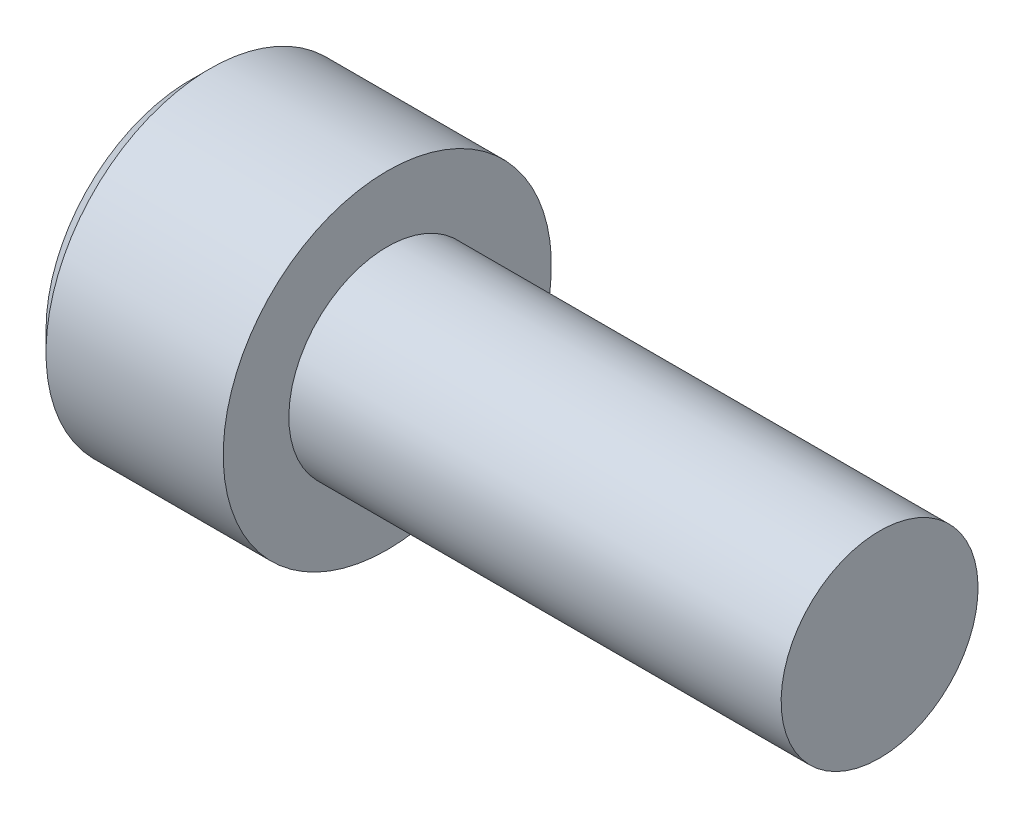
ISO-10303-21;
HEADER;
FILE_DESCRIPTION(('STEP AP214'),'2;1');
FILE_NAME('part.step','',(''),(''),'','','');
FILE_SCHEMA(('AUTOMOTIVE_DESIGN { 1 0 10303 214 1 1 1 1 }'));
ENDSEC;
DATA;
#1=APPLICATION_CONTEXT('core data for automotive mechanical design processes');
#2=APPLICATION_PROTOCOL_DEFINITION('international standard','automotive_design',2000,#1);
#3=PRODUCT_CONTEXT('',#1,'mechanical');
#4=PRODUCT('Part','Part','',(#3));
#5=PRODUCT_RELATED_PRODUCT_CATEGORY('part','',(#4));
#6=PRODUCT_DEFINITION_FORMATION('','',#4);
#7=PRODUCT_DEFINITION_CONTEXT('part definition',#1,'design');
#8=PRODUCT_DEFINITION('design','',#6,#7);
#9=PRODUCT_DEFINITION_SHAPE('','',#8);
#10=(LENGTH_UNIT() NAMED_UNIT(*) SI_UNIT(.MILLI.,.METRE.));
#11=(NAMED_UNIT(*) PLANE_ANGLE_UNIT() SI_UNIT($,.RADIAN.));
#12=(NAMED_UNIT(*) SI_UNIT($,.STERADIAN.) SOLID_ANGLE_UNIT());
#13=UNCERTAINTY_MEASURE_WITH_UNIT(LENGTH_MEASURE(1.E-05),#10,'distance_accuracy_value','');
#14=(GEOMETRIC_REPRESENTATION_CONTEXT(3) GLOBAL_UNCERTAINTY_ASSIGNED_CONTEXT((#13)) GLOBAL_UNIT_ASSIGNED_CONTEXT((#10,
#11,#12)) REPRESENTATION_CONTEXT('',''));
#15=CARTESIAN_POINT('',(0.,0.,0.));
#16=DIRECTION('',(0.,0.,1.));
#17=DIRECTION('',(1.,0.,0.));
#18=AXIS2_PLACEMENT_3D('',#15,#16,#17);
#19=CARTESIAN_POINT('',(-3.,0.,0.));
#20=DIRECTION('',(-1.,0.,0.));
#21=DIRECTION('',(0.,0.,1.));
#22=AXIS2_PLACEMENT_3D('',#19,#20,#21);
#23=PLANE('',#22);
#24=CARTESIAN_POINT('',(-2.9999999999998,0.,0.));
#25=DIRECTION('',(-1.,0.,0.));
#26=DIRECTION('',(0.,0.,1.));
#27=AXIS2_PLACEMENT_3D('',#24,#25,#26);
#28=CIRCLE('',#27,2.49999999999995);
#29=CARTESIAN_POINT('',(-2.9999999999999,2.16506350946107,1.24999999999999));
#30=VERTEX_POINT('',#29);
#31=CARTESIAN_POINT('',(-2.9999999999999,0.,2.49999999999997));
#32=VERTEX_POINT('',#31);
#33=EDGE_CURVE('E20',#30,#32,#28,.F.);
#34=ORIENTED_EDGE('',*,*,#33,.T.);
#35=DIRECTION('',(0.,1.,0.));
#36=VECTOR('',#35,1.);
#37=CARTESIAN_POINT('',(-3.,0.,2.5));
#38=LINE('',#37,#36);
#39=CARTESIAN_POINT('',(-3.,1.44337567297406,2.5));
#40=VERTEX_POINT('',#39);
#41=EDGE_CURVE('E85',#32,#40,#38,.T.);
#42=ORIENTED_EDGE('',*,*,#41,.T.);
#43=DIRECTION('',(0.,0.5,-0.866025403784439));
#44=VECTOR('',#43,1.);
#45=CARTESIAN_POINT('',(-3.,1.44337567297406,2.5));
#46=LINE('',#45,#44);
#47=EDGE_CURVE('E105',#40,#30,#46,.T.);
#48=ORIENTED_EDGE('',*,*,#47,.T.);
#49=EDGE_LOOP('',(#34,#42,#48));
#50=FACE_BOUND('',#49,.T.);
#51=ADVANCED_FACE('F17',(#50),#23,.T.);
#52=CARTESIAN_POINT('',(-3.,0.,0.));
#53=DIRECTION('',(-1.,0.,0.));
#54=DIRECTION('',(0.,0.,1.));
#55=AXIS2_PLACEMENT_3D('',#52,#53,#54);
#56=PLANE('',#55);
#57=CARTESIAN_POINT('',(-2.9999999999998,0.,0.));
#58=DIRECTION('',(-1.,0.,0.));
#59=DIRECTION('',(0.,0.,1.));
#60=AXIS2_PLACEMENT_3D('',#57,#58,#59);
#61=CIRCLE('',#60,2.49999999999995);
#62=CARTESIAN_POINT('',(-2.9999999999999,-2.16506350946107,1.24999999999999));
#63=VERTEX_POINT('',#62);
#64=EDGE_CURVE('E115',#32,#63,#61,.F.);
#65=ORIENTED_EDGE('',*,*,#64,.T.);
#66=DIRECTION('',(0.,0.5,0.866025403784439));
#67=VECTOR('',#66,1.);
#68=CARTESIAN_POINT('',(-3.,-2.1650635094611,1.25));
#69=LINE('',#68,#67);
#70=CARTESIAN_POINT('',(-3.,-1.44337567297406,2.5));
#71=VERTEX_POINT('',#70);
#72=EDGE_CURVE('E123',#63,#71,#69,.T.);
#73=ORIENTED_EDGE('',*,*,#72,.T.);
#74=DIRECTION('',(0.,1.,0.));
#75=VECTOR('',#74,1.);
#76=CARTESIAN_POINT('',(-3.,0.,2.5));
#77=LINE('',#76,#75);
#78=EDGE_CURVE('E131',#71,#32,#77,.T.);
#79=ORIENTED_EDGE('',*,*,#78,.T.);
#80=EDGE_LOOP('',(#65,#73,#79));
#81=FACE_BOUND('',#80,.T.);
#82=ADVANCED_FACE('F367',(#81),#56,.T.);
#83=CARTESIAN_POINT('',(-3.,0.,0.));
#84=DIRECTION('',(-1.,0.,0.));
#85=DIRECTION('',(0.,0.,1.));
#86=AXIS2_PLACEMENT_3D('',#83,#84,#85);
#87=PLANE('',#86);
#88=CARTESIAN_POINT('',(-2.9999999999998,0.,0.));
#89=DIRECTION('',(-1.,0.,0.));
#90=DIRECTION('',(0.,0.,1.));
#91=AXIS2_PLACEMENT_3D('',#88,#89,#90);
#92=CIRCLE('',#91,2.49999999999995);
#93=CARTESIAN_POINT('',(-2.9999999999999,0.,-2.49999999999997));
#94=VERTEX_POINT('',#93);
#95=CARTESIAN_POINT('',(-2.9999999999999,2.16506350946107,-1.24999999999999));
#96=VERTEX_POINT('',#95);
#97=EDGE_CURVE('E101',#94,#96,#92,.F.);
#98=ORIENTED_EDGE('',*,*,#97,.T.);
#99=DIRECTION('',(0.,-0.5,-0.866025403784439));
#100=VECTOR('',#99,1.);
#101=CARTESIAN_POINT('',(-3.,2.1650635094611,-1.25));
#102=LINE('',#101,#100);
#103=CARTESIAN_POINT('',(-3.,1.44337567297406,-2.5));
#104=VERTEX_POINT('',#103);
#105=EDGE_CURVE('E116',#96,#104,#102,.T.);
#106=ORIENTED_EDGE('',*,*,#105,.T.);
#107=DIRECTION('',(0.,1.,0.));
#108=VECTOR('',#107,1.);
#109=CARTESIAN_POINT('',(-3.,0.,-2.5));
#110=LINE('',#109,#108);
#111=EDGE_CURVE('E119',#104,#94,#110,.F.);
#112=ORIENTED_EDGE('',*,*,#111,.T.);
#113=EDGE_LOOP('',(#98,#106,#112));
#114=FACE_BOUND('',#113,.T.);
#115=ADVANCED_FACE('F358',(#114),#87,.T.);
#116=CARTESIAN_POINT('',(-2.99999999999967,0.,0.));
#117=DIRECTION('',(-1.,0.,0.));
#118=DIRECTION('',(0.,0.,1.));
#119=AXIS2_PLACEMENT_3D('',#116,#117,#118);
#120=CONICAL_SURFACE('',#119,2.49999999999972,1.04719755119659);
#121=CARTESIAN_POINT('',(-1.5566243270258,0.,0.));
#122=VERTEX_POINT('',#121);
#123=VERTEX_LOOP('',#122);
#124=FACE_BOUND('',#123,.T.);
#125=ORIENTED_EDGE('',*,*,#33,.F.);
#126=CARTESIAN_POINT('',(-2.9999999999998,0.,0.));
#127=DIRECTION('',(-1.,0.,0.));
#128=DIRECTION('',(0.,0.,1.));
#129=AXIS2_PLACEMENT_3D('',#126,#127,#128);
#130=CIRCLE('',#129,2.49999999999995);
#131=EDGE_CURVE('E91',#96,#30,#130,.F.);
#132=ORIENTED_EDGE('',*,*,#131,.F.);
#133=ORIENTED_EDGE('',*,*,#97,.F.);
#134=CARTESIAN_POINT('',(-2.9999999999998,0.,0.));
#135=DIRECTION('',(-1.,0.,0.));
#136=DIRECTION('',(0.,0.,1.));
#137=AXIS2_PLACEMENT_3D('',#134,#135,#136);
#138=CIRCLE('',#137,2.49999999999995);
#139=CARTESIAN_POINT('',(-2.9999999999999,-2.16506350946107,-1.24999999999999));
#140=VERTEX_POINT('',#139);
#141=EDGE_CURVE('E153',#140,#94,#138,.F.);
#142=ORIENTED_EDGE('',*,*,#141,.F.);
#143=CARTESIAN_POINT('',(-2.9999999999998,0.,0.));
#144=DIRECTION('',(-1.,0.,0.));
#145=DIRECTION('',(0.,0.,1.));
#146=AXIS2_PLACEMENT_3D('',#143,#144,#145);
#147=CIRCLE('',#146,2.49999999999995);
#148=EDGE_CURVE('E117',#63,#140,#147,.F.);
#149=ORIENTED_EDGE('',*,*,#148,.F.);
#150=ORIENTED_EDGE('',*,*,#64,.F.);
#151=EDGE_LOOP('',(#125,#132,#133,#142,#149,#150));
#152=FACE_BOUND('',#151,.T.);
#153=ADVANCED_FACE('F113',(#124,#152),#120,.F.);
#154=CARTESIAN_POINT('',(-3.,0.,0.));
#155=DIRECTION('',(-1.,0.,0.));
#156=DIRECTION('',(0.,0.,1.));
#157=AXIS2_PLACEMENT_3D('',#154,#155,#156);
#158=PLANE('',#157);
#159=ORIENTED_EDGE('',*,*,#141,.T.);
#160=DIRECTION('',(0.,1.,0.));
#161=VECTOR('',#160,1.);
#162=CARTESIAN_POINT('',(-3.,1.44337567297407,-2.5));
#163=LINE('',#162,#161);
#164=CARTESIAN_POINT('',(-3.,-1.44337567297406,-2.5));
#165=VERTEX_POINT('',#164);
#166=EDGE_CURVE('E155',#94,#165,#163,.F.);
#167=ORIENTED_EDGE('',*,*,#166,.T.);
#168=DIRECTION('',(0.,-0.5,0.866025403784438));
#169=VECTOR('',#168,1.);
#170=CARTESIAN_POINT('',(-3.,-1.44337567297406,-2.5));
#171=LINE('',#170,#169);
#172=EDGE_CURVE('E100',#165,#140,#171,.T.);
#173=ORIENTED_EDGE('',*,*,#172,.T.);
#174=EDGE_LOOP('',(#159,#167,#173));
#175=FACE_BOUND('',#174,.T.);
#176=ADVANCED_FACE('F177',(#175),#158,.T.);
#177=CARTESIAN_POINT('',(-3.,0.,0.));
#178=DIRECTION('',(-1.,0.,0.));
#179=DIRECTION('',(0.,0.,1.));
#180=AXIS2_PLACEMENT_3D('',#177,#178,#179);
#181=PLANE('',#180);
#182=ORIENTED_EDGE('',*,*,#148,.T.);
#183=DIRECTION('',(0.,0.5,-0.866025403784439));
#184=VECTOR('',#183,1.);
#185=CARTESIAN_POINT('',(-3.,-1.44337567297406,-2.5));
#186=LINE('',#185,#184);
#187=CARTESIAN_POINT('',(-3.,-2.88675134594813,0.));
#188=VERTEX_POINT('',#187);
#189=EDGE_CURVE('E162',#140,#188,#186,.F.);
#190=ORIENTED_EDGE('',*,*,#189,.T.);
#191=DIRECTION('',(0.,-0.5,-0.866025403784439));
#192=VECTOR('',#191,1.);
#193=CARTESIAN_POINT('',(-3.,-2.88675134594813,0.));
#194=LINE('',#193,#192);
#195=EDGE_CURVE('E141',#188,#63,#194,.F.);
#196=ORIENTED_EDGE('',*,*,#195,.T.);
#197=EDGE_LOOP('',(#182,#190,#196));
#198=FACE_BOUND('',#197,.T.);
#199=ADVANCED_FACE('F161',(#198),#181,.T.);
#200=CARTESIAN_POINT('',(-3.,0.,0.));
#201=DIRECTION('',(-1.,0.,0.));
#202=DIRECTION('',(0.,0.,1.));
#203=AXIS2_PLACEMENT_3D('',#200,#201,#202);
#204=PLANE('',#203);
#205=ORIENTED_EDGE('',*,*,#131,.T.);
#206=DIRECTION('',(0.,-0.5,0.866025403784439));
#207=VECTOR('',#206,1.);
#208=CARTESIAN_POINT('',(-3.,1.44337567297406,2.5));
#209=LINE('',#208,#207);
#210=CARTESIAN_POINT('',(-3.,2.88675134594813,0.));
#211=VERTEX_POINT('',#210);
#212=EDGE_CURVE('E94',#30,#211,#209,.F.);
#213=ORIENTED_EDGE('',*,*,#212,.T.);
#214=DIRECTION('',(0.,0.5,0.866025403784439));
#215=VECTOR('',#214,1.);
#216=CARTESIAN_POINT('',(-3.,2.88675134594813,0.));
#217=LINE('',#216,#215);
#218=EDGE_CURVE('E96',#211,#96,#217,.F.);
#219=ORIENTED_EDGE('',*,*,#218,.T.);
#220=EDGE_LOOP('',(#205,#213,#219));
#221=FACE_BOUND('',#220,.T.);
#222=ADVANCED_FACE('F93',(#221),#204,.T.);
#223=CARTESIAN_POINT('',(-3.,1.44337567297407,-2.5));
#224=DIRECTION('',(0.,0.,-1.));
#225=DIRECTION('',(-1.,0.,0.));
#226=AXIS2_PLACEMENT_3D('',#223,#224,#225);
#227=PLANE('',#226);
#228=DIRECTION('',(1.,0.,0.));
#229=VECTOR('',#228,1.);
#230=CARTESIAN_POINT('',(-3.,-1.44337567297406,-2.5));
#231=LINE('',#230,#229);
#232=CARTESIAN_POINT('',(-6.,-1.44337567297406,-2.5));
#233=VERTEX_POINT('',#232);
#234=EDGE_CURVE('E126',#233,#165,#231,.T.);
#235=ORIENTED_EDGE('',*,*,#234,.T.);
#236=ORIENTED_EDGE('',*,*,#166,.F.);
#237=ORIENTED_EDGE('',*,*,#111,.F.);
#238=DIRECTION('',(1.,0.,0.));
#239=VECTOR('',#238,1.);
#240=CARTESIAN_POINT('',(-3.,1.44337567297407,-2.5));
#241=LINE('',#240,#239);
#242=CARTESIAN_POINT('',(-6.,1.44337567297407,-2.5));
#243=VERTEX_POINT('',#242);
#244=EDGE_CURVE('E134',#104,#243,#241,.F.);
#245=ORIENTED_EDGE('',*,*,#244,.T.);
#246=DIRECTION('',(0.,1.,0.));
#247=VECTOR('',#246,1.);
#248=CARTESIAN_POINT('',(-6.,0.,-2.5));
#249=LINE('',#248,#247);
#250=EDGE_CURVE('E137',#243,#233,#249,.F.);
#251=ORIENTED_EDGE('',*,*,#250,.T.);
#252=EDGE_LOOP('',(#235,#236,#237,#245,#251));
#253=FACE_BOUND('',#252,.T.);
#254=ADVANCED_FACE('F185',(#253),#227,.F.);
#255=CARTESIAN_POINT('',(-3.,-1.44337567297406,-2.5));
#256=DIRECTION('',(0.,-0.866025403784439,-0.5));
#257=DIRECTION('',(0.,0.5,-0.866025403784439));
#258=AXIS2_PLACEMENT_3D('',#255,#256,#257);
#259=PLANE('',#258);
#260=DIRECTION('',(1.,0.,0.));
#261=VECTOR('',#260,1.);
#262=CARTESIAN_POINT('',(-3.,-2.88675134594813,0.));
#263=LINE('',#262,#261);
#264=CARTESIAN_POINT('',(-6.,-2.88675134594813,0.));
#265=VERTEX_POINT('',#264);
#266=EDGE_CURVE('E173',#265,#188,#263,.T.);
#267=ORIENTED_EDGE('',*,*,#266,.T.);
#268=ORIENTED_EDGE('',*,*,#189,.F.);
#269=ORIENTED_EDGE('',*,*,#172,.F.);
#270=ORIENTED_EDGE('',*,*,#234,.F.);
#271=DIRECTION('',(0.,-0.5,0.866025403784439));
#272=VECTOR('',#271,1.);
#273=CARTESIAN_POINT('',(-6.,-1.44337567297406,-2.5));
#274=LINE('',#273,#272);
#275=EDGE_CURVE('E188',#233,#265,#274,.T.);
#276=ORIENTED_EDGE('',*,*,#275,.T.);
#277=EDGE_LOOP('',(#267,#268,#269,#270,#276));
#278=FACE_BOUND('',#277,.T.);
#279=ADVANCED_FACE('F168',(#278),#259,.F.);
#280=CARTESIAN_POINT('',(-3.,-2.88675134594813,0.));
#281=DIRECTION('',(0.,-0.866025403784439,0.5));
#282=DIRECTION('',(0.,-0.5,-0.866025403784439));
#283=AXIS2_PLACEMENT_3D('',#280,#281,#282);
#284=PLANE('',#283);
#285=DIRECTION('',(1.,0.,0.));
#286=VECTOR('',#285,1.);
#287=CARTESIAN_POINT('',(-3.,-1.44337567297406,2.5));
#288=LINE('',#287,#286);
#289=CARTESIAN_POINT('',(-6.,-1.44337567297406,2.5));
#290=VERTEX_POINT('',#289);
#291=EDGE_CURVE('E138',#290,#71,#288,.T.);
#292=ORIENTED_EDGE('',*,*,#291,.T.);
#293=ORIENTED_EDGE('',*,*,#72,.F.);
#294=ORIENTED_EDGE('',*,*,#195,.F.);
#295=ORIENTED_EDGE('',*,*,#266,.F.);
#296=DIRECTION('',(0.,0.5,0.866025403784439));
#297=VECTOR('',#296,1.);
#298=CARTESIAN_POINT('',(-6.,-2.88675134594813,0.));
#299=LINE('',#298,#297);
#300=EDGE_CURVE('E181',#265,#290,#299,.T.);
#301=ORIENTED_EDGE('',*,*,#300,.T.);
#302=EDGE_LOOP('',(#292,#293,#294,#295,#301));
#303=FACE_BOUND('',#302,.T.);
#304=ADVANCED_FACE('F307',(#303),#284,.F.);
#305=CARTESIAN_POINT('',(-3.,-1.44337567297406,2.5));
#306=DIRECTION('',(0.,0.,1.));
#307=DIRECTION('',(1.,0.,0.));
#308=AXIS2_PLACEMENT_3D('',#305,#306,#307);
#309=PLANE('',#308);
#310=DIRECTION('',(1.,0.,0.));
#311=VECTOR('',#310,1.);
#312=CARTESIAN_POINT('',(-3.,1.44337567297406,2.5));
#313=LINE('',#312,#311);
#314=CARTESIAN_POINT('',(-6.,1.44337567297406,2.5));
#315=VERTEX_POINT('',#314);
#316=EDGE_CURVE('E107',#315,#40,#313,.T.);
#317=ORIENTED_EDGE('',*,*,#316,.T.);
#318=ORIENTED_EDGE('',*,*,#41,.F.);
#319=ORIENTED_EDGE('',*,*,#78,.F.);
#320=ORIENTED_EDGE('',*,*,#291,.F.);
#321=DIRECTION('',(0.,1.,0.));
#322=VECTOR('',#321,1.);
#323=CARTESIAN_POINT('',(-6.,0.,2.5));
#324=LINE('',#323,#322);
#325=EDGE_CURVE('E196',#290,#315,#324,.T.);
#326=ORIENTED_EDGE('',*,*,#325,.T.);
#327=EDGE_LOOP('',(#317,#318,#319,#320,#326));
#328=FACE_BOUND('',#327,.T.);
#329=ADVANCED_FACE('F299',(#328),#309,.F.);
#330=CARTESIAN_POINT('',(-3.,1.44337567297406,2.5));
#331=DIRECTION('',(0.,0.866025403784439,0.5));
#332=DIRECTION('',(0.,-0.5,0.866025403784439));
#333=AXIS2_PLACEMENT_3D('',#330,#331,#332);
#334=PLANE('',#333);
#335=DIRECTION('',(1.,0.,0.));
#336=VECTOR('',#335,1.);
#337=CARTESIAN_POINT('',(-3.,2.88675134594813,0.));
#338=LINE('',#337,#336);
#339=CARTESIAN_POINT('',(-6.,2.88675134594813,0.));
#340=VERTEX_POINT('',#339);
#341=EDGE_CURVE('E106',#340,#211,#338,.T.);
#342=ORIENTED_EDGE('',*,*,#341,.T.);
#343=ORIENTED_EDGE('',*,*,#212,.F.);
#344=ORIENTED_EDGE('',*,*,#47,.F.);
#345=ORIENTED_EDGE('',*,*,#316,.F.);
#346=DIRECTION('',(0.,0.5,-0.866025403784439));
#347=VECTOR('',#346,1.);
#348=CARTESIAN_POINT('',(-6.,1.44337567297406,2.5));
#349=LINE('',#348,#347);
#350=EDGE_CURVE('E35',#315,#340,#349,.T.);
#351=ORIENTED_EDGE('',*,*,#350,.T.);
#352=EDGE_LOOP('',(#342,#343,#344,#345,#351));
#353=FACE_BOUND('',#352,.T.);
#354=ADVANCED_FACE('F104',(#353),#334,.F.);
#355=CARTESIAN_POINT('',(-3.,2.88675134594813,0.));
#356=DIRECTION('',(0.,0.866025403784439,-0.5));
#357=DIRECTION('',(0.,0.5,0.866025403784439));
#358=AXIS2_PLACEMENT_3D('',#355,#356,#357);
#359=PLANE('',#358);
#360=ORIENTED_EDGE('',*,*,#244,.F.);
#361=ORIENTED_EDGE('',*,*,#105,.F.);
#362=ORIENTED_EDGE('',*,*,#218,.F.);
#363=ORIENTED_EDGE('',*,*,#341,.F.);
#364=DIRECTION('',(0.,-0.5,-0.866025403784439));
#365=VECTOR('',#364,1.);
#366=CARTESIAN_POINT('',(-6.,2.88675134594813,0.));
#367=LINE('',#366,#365);
#368=EDGE_CURVE('E152',#340,#243,#367,.T.);
#369=ORIENTED_EDGE('',*,*,#368,.T.);
#370=EDGE_LOOP('',(#360,#361,#362,#363,#369));
#371=FACE_BOUND('',#370,.T.);
#372=ADVANCED_FACE('F219',(#371),#359,.F.);
#373=CARTESIAN_POINT('',(-6.,0.,0.));
#374=DIRECTION('',(1.,0.,0.));
#375=DIRECTION('',(0.,1.,0.));
#376=AXIS2_PLACEMENT_3D('',#373,#374,#375);
#377=PLANE('',#376);
#378=ORIENTED_EDGE('',*,*,#350,.F.);
#379=ORIENTED_EDGE('',*,*,#325,.F.);
#380=ORIENTED_EDGE('',*,*,#300,.F.);
#381=ORIENTED_EDGE('',*,*,#275,.F.);
#382=ORIENTED_EDGE('',*,*,#250,.F.);
#383=ORIENTED_EDGE('',*,*,#368,.F.);
#384=EDGE_LOOP('',(#378,#379,#380,#381,#382,#383));
#385=FACE_BOUND('',#384,.T.);
#386=CARTESIAN_POINT('',(-6.00000000002865,0.,0.));
#387=DIRECTION('',(1.,0.,0.));
#388=DIRECTION('',(0.,0.,-1.));
#389=AXIS2_PLACEMENT_3D('',#386,#387,#388);
#390=CIRCLE('',#389,4.39999999997553);
#391=CARTESIAN_POINT('',(-6.00000000002865,0.,-4.39999999997553));
#392=VERTEX_POINT('',#391);
#393=EDGE_CURVE('E149',#392,#392,#390,.T.);
#394=ORIENTED_EDGE('',*,*,#393,.F.);
#395=EDGE_LOOP('',(#394));
#396=FACE_BOUND('',#395,.T.);
#397=ADVANCED_FACE('F191',(#385,#396),#377,.F.);
#398=CARTESIAN_POINT('',(-5.40000000012242,0.,0.));
#399=DIRECTION('',(1.,0.,0.));
#400=DIRECTION('',(0.,0.,-1.));
#401=AXIS2_PLACEMENT_3D('',#398,#399,#400);
#402=CONICAL_SURFACE('',#401,4.99999999988177,0.785398163397448);
#403=CARTESIAN_POINT('',(-5.4,0.,0.));
#404=DIRECTION('',(-1.,0.,0.));
#405=DIRECTION('',(0.,-1.,0.));
#406=AXIS2_PLACEMENT_3D('',#403,#404,#405);
#407=CIRCLE('',#406,5.);
#408=CARTESIAN_POINT('',(-5.4,-5.,0.));
#409=VERTEX_POINT('',#408);
#410=EDGE_CURVE('E148',#409,#409,#407,.F.);
#411=ORIENTED_EDGE('',*,*,#410,.F.);
#412=EDGE_LOOP('',(#411));
#413=FACE_BOUND('',#412,.T.);
#414=ORIENTED_EDGE('',*,*,#393,.T.);
#415=EDGE_LOOP('',(#414));
#416=FACE_BOUND('',#415,.T.);
#417=ADVANCED_FACE('F213',(#413,#416),#402,.T.);
#418=CARTESIAN_POINT('',(-6.,0.,0.));
#419=DIRECTION('',(-1.,0.,0.));
#420=DIRECTION('',(0.,-1.,0.));
#421=AXIS2_PLACEMENT_3D('',#418,#419,#420);
#422=CYLINDRICAL_SURFACE('',#421,5.);
#423=ORIENTED_EDGE('',*,*,#410,.T.);
#424=EDGE_LOOP('',(#423));
#425=FACE_BOUND('',#424,.T.);
#426=CARTESIAN_POINT('',(0.,0.,0.));
#427=DIRECTION('',(-1.,0.,0.));
#428=DIRECTION('',(0.,-1.,0.));
#429=AXIS2_PLACEMENT_3D('',#426,#427,#428);
#430=CIRCLE('',#429,5.);
#431=CARTESIAN_POINT('',(0.,-5.,0.));
#432=VERTEX_POINT('',#431);
#433=EDGE_CURVE('E145',#432,#432,#430,.T.);
#434=ORIENTED_EDGE('',*,*,#433,.T.);
#435=EDGE_LOOP('',(#434));
#436=FACE_BOUND('',#435,.T.);
#437=ADVANCED_FACE('F210',(#425,#436),#422,.T.);
#438=CARTESIAN_POINT('',(15.,3.,0.));
#439=DIRECTION('',(-1.,0.,0.));
#440=DIRECTION('',(0.,-1.,0.));
#441=AXIS2_PLACEMENT_3D('',#438,#439,#440);
#442=PLANE('',#441);
#443=CARTESIAN_POINT('',(15.,0.,0.));
#444=DIRECTION('',(-1.,0.,0.));
#445=DIRECTION('',(0.,-1.,0.));
#446=AXIS2_PLACEMENT_3D('',#443,#444,#445);
#447=CIRCLE('',#446,3.);
#448=CARTESIAN_POINT('',(15.,-3.,0.));
#449=VERTEX_POINT('',#448);
#450=EDGE_CURVE('E26',#449,#449,#447,.T.);
#451=ORIENTED_EDGE('',*,*,#450,.F.);
#452=EDGE_LOOP('',(#451));
#453=FACE_BOUND('',#452,.T.);
#454=ADVANCED_FACE('F235',(#453),#442,.F.);
#455=CARTESIAN_POINT('',(0.,3.,0.));
#456=DIRECTION('',(-1.,0.,0.));
#457=DIRECTION('',(0.,-1.,0.));
#458=AXIS2_PLACEMENT_3D('',#455,#456,#457);
#459=PLANE('',#458);
#460=CARTESIAN_POINT('',(0.,0.,0.));
#461=DIRECTION('',(-1.,0.,0.));
#462=DIRECTION('',(0.,-1.,0.));
#463=AXIS2_PLACEMENT_3D('',#460,#461,#462);
#464=CIRCLE('',#463,3.);
#465=CARTESIAN_POINT('',(0.,-3.,0.));
#466=VERTEX_POINT('',#465);
#467=EDGE_CURVE('E10',#466,#466,#464,.F.);
#468=ORIENTED_EDGE('',*,*,#467,.F.);
#469=EDGE_LOOP('',(#468));
#470=FACE_BOUND('',#469,.T.);
#471=ORIENTED_EDGE('',*,*,#433,.F.);
#472=EDGE_LOOP('',(#471));
#473=FACE_BOUND('',#472,.T.);
#474=ADVANCED_FACE('F229',(#470,#473),#459,.F.);
#475=CARTESIAN_POINT('',(-6.,0.,0.));
#476=DIRECTION('',(-1.,0.,0.));
#477=DIRECTION('',(0.,-1.,0.));
#478=AXIS2_PLACEMENT_3D('',#475,#476,#477);
#479=CYLINDRICAL_SURFACE('',#478,3.);
#480=ORIENTED_EDGE('',*,*,#467,.T.);
#481=EDGE_LOOP('',(#480));
#482=FACE_BOUND('',#481,.T.);
#483=ORIENTED_EDGE('',*,*,#450,.T.);
#484=EDGE_LOOP('',(#483));
#485=FACE_BOUND('',#484,.T.);
#486=ADVANCED_FACE('F227',(#482,#485),#479,.T.);
#487=CLOSED_SHELL('',(#51,#82,#115,#153,#176,#199,#222,#254,#279,#304,#329,#354,#372,#397,#417,
#437,#454,#474,#486));
#488=MANIFOLD_SOLID_BREP('B1',#487);
#489=ADVANCED_BREP_SHAPE_REPRESENTATION('',(#18,#488),#14);
#490=SHAPE_DEFINITION_REPRESENTATION(#9,#489);
ENDSEC;
END-ISO-10303-21;
